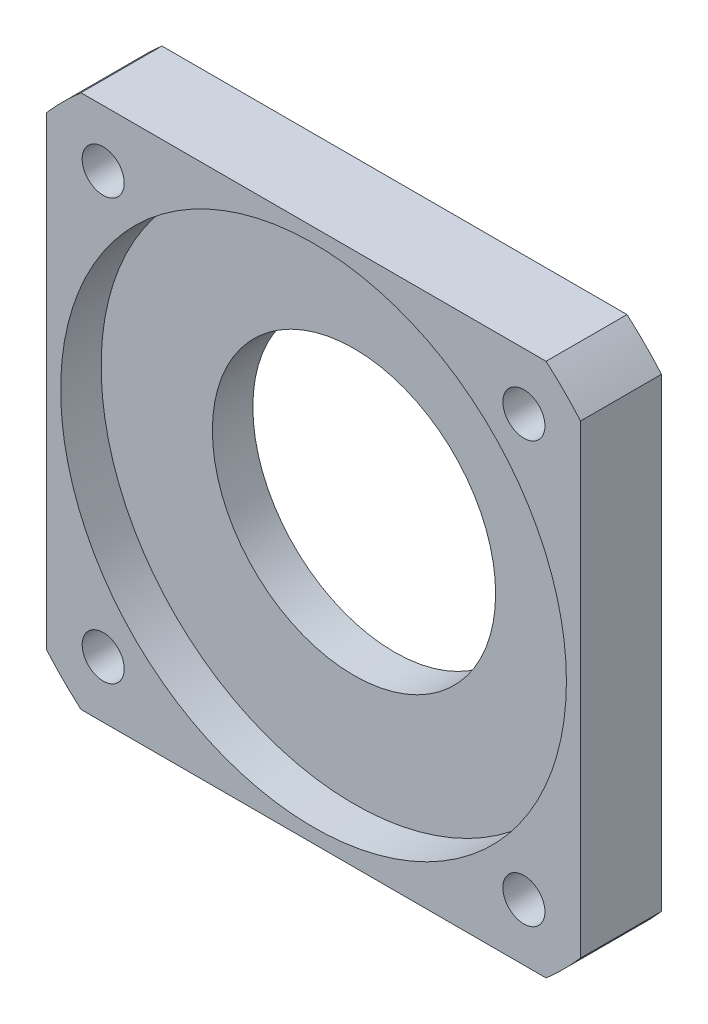
ISO-10303-21;
HEADER;
FILE_DESCRIPTION(('STEP AP214'),'2;1');
FILE_NAME('part.step','',(''),(''),'','','');
FILE_SCHEMA(('AUTOMOTIVE_DESIGN { 1 0 10303 214 1 1 1 1 }'));
ENDSEC;
DATA;
#1=APPLICATION_CONTEXT('core data for automotive mechanical design processes');
#2=APPLICATION_PROTOCOL_DEFINITION('international standard','automotive_design',2000,#1);
#3=PRODUCT_CONTEXT('',#1,'mechanical');
#4=PRODUCT('Part','Part','',(#3));
#5=PRODUCT_RELATED_PRODUCT_CATEGORY('part','',(#4));
#6=PRODUCT_DEFINITION_FORMATION('','',#4);
#7=PRODUCT_DEFINITION_CONTEXT('part definition',#1,'design');
#8=PRODUCT_DEFINITION('design','',#6,#7);
#9=PRODUCT_DEFINITION_SHAPE('','',#8);
#10=(LENGTH_UNIT() NAMED_UNIT(*) SI_UNIT(.MILLI.,.METRE.));
#11=(NAMED_UNIT(*) PLANE_ANGLE_UNIT() SI_UNIT($,.RADIAN.));
#12=(NAMED_UNIT(*) SI_UNIT($,.STERADIAN.) SOLID_ANGLE_UNIT());
#13=UNCERTAINTY_MEASURE_WITH_UNIT(LENGTH_MEASURE(1.E-05),#10,'distance_accuracy_value','');
#14=(GEOMETRIC_REPRESENTATION_CONTEXT(3) GLOBAL_UNCERTAINTY_ASSIGNED_CONTEXT((#13)) GLOBAL_UNIT_ASSIGNED_CONTEXT((#10,
#11,#12)) REPRESENTATION_CONTEXT('',''));
#15=CARTESIAN_POINT('',(0.,0.,0.));
#16=DIRECTION('',(0.,0.,1.));
#17=DIRECTION('',(1.,0.,0.));
#18=AXIS2_PLACEMENT_3D('',#15,#16,#17);
#19=CARTESIAN_POINT('',(20.955,20.955,6.35));
#20=DIRECTION('',(0.,0.,-1.));
#21=DIRECTION('',(-1.,0.,0.));
#22=AXIS2_PLACEMENT_3D('',#19,#20,#21);
#23=CYLINDRICAL_SURFACE('',#22,11.1125);
#24=CARTESIAN_POINT('',(20.955,20.955,0.));
#25=DIRECTION('',(0.,0.,1.));
#26=DIRECTION('',(1.,0.,0.));
#27=AXIS2_PLACEMENT_3D('',#24,#25,#26);
#28=CIRCLE('',#27,11.1125);
#29=CARTESIAN_POINT('',(32.0675,20.955,0.));
#30=VERTEX_POINT('',#29);
#31=EDGE_CURVE('E154',#30,#30,#28,.T.);
#32=ORIENTED_EDGE('',*,*,#31,.F.);
#33=EDGE_LOOP('',(#32));
#34=FACE_BOUND('',#33,.T.);
#35=CARTESIAN_POINT('',(20.955,20.955,3.175));
#36=DIRECTION('',(0.,0.,1.));
#37=DIRECTION('',(1.,0.,0.));
#38=AXIS2_PLACEMENT_3D('',#35,#36,#37);
#39=CIRCLE('',#38,11.1125);
#40=CARTESIAN_POINT('',(32.0675,20.955,3.175));
#41=VERTEX_POINT('',#40);
#42=EDGE_CURVE('E37',#41,#41,#39,.T.);
#43=ORIENTED_EDGE('',*,*,#42,.T.);
#44=EDGE_LOOP('',(#43));
#45=FACE_BOUND('',#44,.T.);
#46=ADVANCED_FACE('F33',(#34,#45),#23,.F.);
#47=CARTESIAN_POINT('',(0.,0.,6.35));
#48=DIRECTION('',(0.,0.,-1.));
#49=DIRECTION('',(-1.,0.,0.));
#50=AXIS2_PLACEMENT_3D('',#47,#48,#49);
#51=PLANE('',#50);
#52=CARTESIAN_POINT('',(20.955,20.955,6.35));
#53=DIRECTION('',(0.,0.,1.));
#54=DIRECTION('',(1.,0.,0.));
#55=AXIS2_PLACEMENT_3D('',#52,#53,#54);
#56=CIRCLE('',#55,19.84375);
#57=CARTESIAN_POINT('',(40.79875,20.955,6.35));
#58=VERTEX_POINT('',#57);
#59=EDGE_CURVE('E243',#58,#58,#56,.T.);
#60=ORIENTED_EDGE('',*,*,#59,.F.);
#61=EDGE_LOOP('',(#60));
#62=FACE_BOUND('',#61,.T.);
#63=CARTESIAN_POINT('',(4.44928924947582,4.44928924947489,6.35));
#64=DIRECTION('',(0.,0.,1.));
#65=DIRECTION('',(1.,0.,0.));
#66=AXIS2_PLACEMENT_3D('',#63,#64,#65);
#67=CIRCLE('',#66,1.64973);
#68=CARTESIAN_POINT('',(6.09901924947582,4.44928924947489,6.35));
#69=VERTEX_POINT('',#68);
#70=EDGE_CURVE('E188',#69,#69,#67,.T.);
#71=ORIENTED_EDGE('',*,*,#70,.F.);
#72=EDGE_LOOP('',(#71));
#73=FACE_BOUND('',#72,.T.);
#74=CARTESIAN_POINT('',(37.4607107505251,37.4607107505251,6.35));
#75=DIRECTION('',(0.,0.,1.));
#76=DIRECTION('',(1.,0.,0.));
#77=AXIS2_PLACEMENT_3D('',#74,#75,#76);
#78=CIRCLE('',#77,1.64973);
#79=CARTESIAN_POINT('',(39.1104407505251,37.4607107505251,6.35));
#80=VERTEX_POINT('',#79);
#81=EDGE_CURVE('E144',#80,#80,#78,.T.);
#82=ORIENTED_EDGE('',*,*,#81,.F.);
#83=EDGE_LOOP('',(#82));
#84=FACE_BOUND('',#83,.T.);
#85=CARTESIAN_POINT('',(37.4607107505255,4.44928924947537,6.35));
#86=DIRECTION('',(0.,0.,1.));
#87=DIRECTION('',(1.,0.,0.));
#88=AXIS2_PLACEMENT_3D('',#85,#86,#87);
#89=CIRCLE('',#88,1.64973);
#90=CARTESIAN_POINT('',(39.1104407505255,4.44928924947537,6.35));
#91=VERTEX_POINT('',#90);
#92=EDGE_CURVE('E194',#91,#91,#89,.T.);
#93=ORIENTED_EDGE('',*,*,#92,.F.);
#94=EDGE_LOOP('',(#93));
#95=FACE_BOUND('',#94,.T.);
#96=CARTESIAN_POINT('',(4.44928924947507,37.4607107505243,6.35));
#97=DIRECTION('',(0.,0.,1.));
#98=DIRECTION('',(1.,0.,0.));
#99=AXIS2_PLACEMENT_3D('',#96,#97,#98);
#100=CIRCLE('',#99,1.64973);
#101=CARTESIAN_POINT('',(6.09901924947507,37.4607107505243,6.35));
#102=VERTEX_POINT('',#101);
#103=EDGE_CURVE('E182',#102,#102,#100,.T.);
#104=ORIENTED_EDGE('',*,*,#103,.F.);
#105=EDGE_LOOP('',(#104));
#106=FACE_BOUND('',#105,.T.);
#107=CARTESIAN_POINT('',(20.955,20.955,6.35));
#108=DIRECTION('',(0.,0.,1.));
#109=DIRECTION('',(1.,0.,0.));
#110=AXIS2_PLACEMENT_3D('',#107,#108,#109);
#111=CIRCLE('',#110,27.7876);
#112=CARTESIAN_POINT('',(2.70565237439978,41.91,6.35));
#113=VERTEX_POINT('',#112);
#114=CARTESIAN_POINT('',(0.,39.2043476256002,6.35));
#115=VERTEX_POINT('',#114);
#116=EDGE_CURVE('E245',#113,#115,#111,.T.);
#117=ORIENTED_EDGE('',*,*,#116,.T.);
#118=DIRECTION('',(0.,-1.,0.));
#119=VECTOR('',#118,1.);
#120=CARTESIAN_POINT('',(0.,0.,6.35));
#121=LINE('',#120,#119);
#122=CARTESIAN_POINT('',(0.,2.70565237439979,6.35));
#123=VERTEX_POINT('',#122);
#124=EDGE_CURVE('E124',#115,#123,#121,.T.);
#125=ORIENTED_EDGE('',*,*,#124,.T.);
#126=CARTESIAN_POINT('',(2.70565237439979,0.,6.35));
#127=VERTEX_POINT('',#126);
#128=EDGE_CURVE('E166',#123,#127,#111,.T.);
#129=ORIENTED_EDGE('',*,*,#128,.T.);
#130=DIRECTION('',(1.,0.,0.));
#131=VECTOR('',#130,1.);
#132=CARTESIAN_POINT('',(0.,0.,6.35));
#133=LINE('',#132,#131);
#134=CARTESIAN_POINT('',(39.2043476256002,0.,6.35));
#135=VERTEX_POINT('',#134);
#136=EDGE_CURVE('E140',#127,#135,#133,.T.);
#137=ORIENTED_EDGE('',*,*,#136,.T.);
#138=CARTESIAN_POINT('',(41.91,2.70565237439978,6.35));
#139=VERTEX_POINT('',#138);
#140=EDGE_CURVE('E165',#135,#139,#111,.T.);
#141=ORIENTED_EDGE('',*,*,#140,.T.);
#142=DIRECTION('',(0.,1.,0.));
#143=VECTOR('',#142,1.);
#144=CARTESIAN_POINT('',(41.91,0.,6.35));
#145=LINE('',#144,#143);
#146=CARTESIAN_POINT('',(41.91,39.2043476256002,6.35));
#147=VERTEX_POINT('',#146);
#148=EDGE_CURVE('E135',#139,#147,#145,.T.);
#149=ORIENTED_EDGE('',*,*,#148,.T.);
#150=CARTESIAN_POINT('',(39.2043476256002,41.91,6.35));
#151=VERTEX_POINT('',#150);
#152=EDGE_CURVE('E103',#147,#151,#111,.T.);
#153=ORIENTED_EDGE('',*,*,#152,.T.);
#154=DIRECTION('',(-1.,0.,0.));
#155=VECTOR('',#154,1.);
#156=CARTESIAN_POINT('',(0.,41.91,6.35));
#157=LINE('',#156,#155);
#158=EDGE_CURVE('E131',#151,#113,#157,.T.);
#159=ORIENTED_EDGE('',*,*,#158,.T.);
#160=EDGE_LOOP('',(#117,#125,#129,#137,#141,#149,#153,#159));
#161=FACE_BOUND('',#160,.T.);
#162=ADVANCED_FACE('F164',(#62,#73,#84,#95,#106,#161),#51,.F.);
#163=CARTESIAN_POINT('',(0.,0.,0.));
#164=DIRECTION('',(0.,0.,-1.));
#165=DIRECTION('',(-1.,0.,0.));
#166=AXIS2_PLACEMENT_3D('',#163,#164,#165);
#167=PLANE('',#166);
#168=CARTESIAN_POINT('',(4.44928924947582,4.44928924947489,0.));
#169=DIRECTION('',(0.,0.,1.));
#170=DIRECTION('',(1.,0.,0.));
#171=AXIS2_PLACEMENT_3D('',#168,#169,#170);
#172=CIRCLE('',#171,1.64973);
#173=CARTESIAN_POINT('',(6.09901924947582,4.44928924947489,0.));
#174=VERTEX_POINT('',#173);
#175=EDGE_CURVE('E185',#174,#174,#172,.T.);
#176=ORIENTED_EDGE('',*,*,#175,.T.);
#177=EDGE_LOOP('',(#176));
#178=FACE_BOUND('',#177,.T.);
#179=ORIENTED_EDGE('',*,*,#31,.T.);
#180=EDGE_LOOP('',(#179));
#181=FACE_BOUND('',#180,.T.);
#182=CARTESIAN_POINT('',(37.4607107505251,37.4607107505251,0.));
#183=DIRECTION('',(0.,0.,1.));
#184=DIRECTION('',(1.,0.,0.));
#185=AXIS2_PLACEMENT_3D('',#182,#183,#184);
#186=CIRCLE('',#185,1.64973);
#187=CARTESIAN_POINT('',(39.1104407505251,37.4607107505251,0.));
#188=VERTEX_POINT('',#187);
#189=EDGE_CURVE('E149',#188,#188,#186,.T.);
#190=ORIENTED_EDGE('',*,*,#189,.T.);
#191=EDGE_LOOP('',(#190));
#192=FACE_BOUND('',#191,.T.);
#193=CARTESIAN_POINT('',(37.4607107505255,4.44928924947537,0.));
#194=DIRECTION('',(0.,0.,1.));
#195=DIRECTION('',(1.,0.,0.));
#196=AXIS2_PLACEMENT_3D('',#193,#194,#195);
#197=CIRCLE('',#196,1.64973);
#198=CARTESIAN_POINT('',(39.1104407505255,4.44928924947537,0.));
#199=VERTEX_POINT('',#198);
#200=EDGE_CURVE('E191',#199,#199,#197,.T.);
#201=ORIENTED_EDGE('',*,*,#200,.T.);
#202=EDGE_LOOP('',(#201));
#203=FACE_BOUND('',#202,.T.);
#204=CARTESIAN_POINT('',(4.44928924947507,37.4607107505243,0.));
#205=DIRECTION('',(0.,0.,1.));
#206=DIRECTION('',(1.,0.,0.));
#207=AXIS2_PLACEMENT_3D('',#204,#205,#206);
#208=CIRCLE('',#207,1.64973);
#209=CARTESIAN_POINT('',(6.09901924947507,37.4607107505243,0.));
#210=VERTEX_POINT('',#209);
#211=EDGE_CURVE('E181',#210,#210,#208,.T.);
#212=ORIENTED_EDGE('',*,*,#211,.T.);
#213=EDGE_LOOP('',(#212));
#214=FACE_BOUND('',#213,.T.);
#215=DIRECTION('',(0.,-1.,0.));
#216=VECTOR('',#215,1.);
#217=CARTESIAN_POINT('',(0.,0.,0.));
#218=LINE('',#217,#216);
#219=CARTESIAN_POINT('',(0.,39.2043476256002,0.));
#220=VERTEX_POINT('',#219);
#221=CARTESIAN_POINT('',(0.,2.70565237439979,0.));
#222=VERTEX_POINT('',#221);
#223=EDGE_CURVE('E127',#220,#222,#218,.T.);
#224=ORIENTED_EDGE('',*,*,#223,.F.);
#225=CARTESIAN_POINT('',(20.955,20.955,0.));
#226=DIRECTION('',(0.,0.,1.));
#227=DIRECTION('',(1.,0.,0.));
#228=AXIS2_PLACEMENT_3D('',#225,#226,#227);
#229=CIRCLE('',#228,27.7876);
#230=CARTESIAN_POINT('',(2.70565237439978,41.91,0.));
#231=VERTEX_POINT('',#230);
#232=EDGE_CURVE('E119',#231,#220,#229,.T.);
#233=ORIENTED_EDGE('',*,*,#232,.F.);
#234=DIRECTION('',(-1.,0.,0.));
#235=VECTOR('',#234,1.);
#236=CARTESIAN_POINT('',(0.,41.91,0.));
#237=LINE('',#236,#235);
#238=CARTESIAN_POINT('',(39.2043476256002,41.91,0.));
#239=VERTEX_POINT('',#238);
#240=EDGE_CURVE('E118',#239,#231,#237,.T.);
#241=ORIENTED_EDGE('',*,*,#240,.F.);
#242=CARTESIAN_POINT('',(41.91,39.2043476256002,0.));
#243=VERTEX_POINT('',#242);
#244=EDGE_CURVE('E100',#243,#239,#229,.T.);
#245=ORIENTED_EDGE('',*,*,#244,.F.);
#246=DIRECTION('',(0.,1.,0.));
#247=VECTOR('',#246,1.);
#248=CARTESIAN_POINT('',(41.91,0.,0.));
#249=LINE('',#248,#247);
#250=CARTESIAN_POINT('',(41.91,2.70565237439978,0.));
#251=VERTEX_POINT('',#250);
#252=EDGE_CURVE('E115',#251,#243,#249,.T.);
#253=ORIENTED_EDGE('',*,*,#252,.F.);
#254=CARTESIAN_POINT('',(39.2043476256002,0.,0.));
#255=VERTEX_POINT('',#254);
#256=EDGE_CURVE('E57',#255,#251,#229,.T.);
#257=ORIENTED_EDGE('',*,*,#256,.F.);
#258=DIRECTION('',(1.,0.,0.));
#259=VECTOR('',#258,1.);
#260=CARTESIAN_POINT('',(0.,0.,0.));
#261=LINE('',#260,#259);
#262=CARTESIAN_POINT('',(2.70565237439979,0.,0.));
#263=VERTEX_POINT('',#262);
#264=EDGE_CURVE('E122',#263,#255,#261,.T.);
#265=ORIENTED_EDGE('',*,*,#264,.F.);
#266=EDGE_CURVE('E49',#222,#263,#229,.T.);
#267=ORIENTED_EDGE('',*,*,#266,.F.);
#268=EDGE_LOOP('',(#224,#233,#241,#245,#253,#257,#265,#267));
#269=FACE_BOUND('',#268,.T.);
#270=ADVANCED_FACE('F114',(#178,#181,#192,#203,#214,#269),#167,.T.);
#271=CARTESIAN_POINT('',(0.,0.,6.35));
#272=DIRECTION('',(1.,0.,0.));
#273=DIRECTION('',(0.,0.,-1.));
#274=AXIS2_PLACEMENT_3D('',#271,#272,#273);
#275=PLANE('',#274);
#276=DIRECTION('',(0.,0.,1.));
#277=VECTOR('',#276,1.);
#278=CARTESIAN_POINT('',(0.,39.2043476256002,0.));
#279=LINE('',#278,#277);
#280=EDGE_CURVE('E179',#220,#115,#279,.T.);
#281=ORIENTED_EDGE('',*,*,#280,.F.);
#282=ORIENTED_EDGE('',*,*,#223,.T.);
#283=DIRECTION('',(0.,0.,1.));
#284=VECTOR('',#283,1.);
#285=CARTESIAN_POINT('',(0.,2.70565237439979,0.));
#286=LINE('',#285,#284);
#287=EDGE_CURVE('E174',#123,#222,#286,.F.);
#288=ORIENTED_EDGE('',*,*,#287,.F.);
#289=ORIENTED_EDGE('',*,*,#124,.F.);
#290=EDGE_LOOP('',(#281,#282,#288,#289));
#291=FACE_BOUND('',#290,.T.);
#292=ADVANCED_FACE('F35',(#291),#275,.F.);
#293=CARTESIAN_POINT('',(0.,0.,6.35));
#294=DIRECTION('',(0.,1.,0.));
#295=DIRECTION('',(0.,0.,1.));
#296=AXIS2_PLACEMENT_3D('',#293,#294,#295);
#297=PLANE('',#296);
#298=DIRECTION('',(0.,0.,1.));
#299=VECTOR('',#298,1.);
#300=CARTESIAN_POINT('',(2.70565237439979,0.,0.));
#301=LINE('',#300,#299);
#302=EDGE_CURVE('E170',#263,#127,#301,.T.);
#303=ORIENTED_EDGE('',*,*,#302,.F.);
#304=ORIENTED_EDGE('',*,*,#264,.T.);
#305=DIRECTION('',(0.,0.,1.));
#306=VECTOR('',#305,1.);
#307=CARTESIAN_POINT('',(39.2043476256002,0.,0.));
#308=LINE('',#307,#306);
#309=EDGE_CURVE('E172',#135,#255,#308,.F.);
#310=ORIENTED_EDGE('',*,*,#309,.F.);
#311=ORIENTED_EDGE('',*,*,#136,.F.);
#312=EDGE_LOOP('',(#303,#304,#310,#311));
#313=FACE_BOUND('',#312,.T.);
#314=ADVANCED_FACE('F169',(#313),#297,.F.);
#315=CARTESIAN_POINT('',(41.91,0.,6.35));
#316=DIRECTION('',(-1.,0.,0.));
#317=DIRECTION('',(0.,0.,1.));
#318=AXIS2_PLACEMENT_3D('',#315,#316,#317);
#319=PLANE('',#318);
#320=DIRECTION('',(0.,0.,1.));
#321=VECTOR('',#320,1.);
#322=CARTESIAN_POINT('',(41.91,2.70565237439978,0.));
#323=LINE('',#322,#321);
#324=EDGE_CURVE('E108',#251,#139,#323,.T.);
#325=ORIENTED_EDGE('',*,*,#324,.F.);
#326=ORIENTED_EDGE('',*,*,#252,.T.);
#327=DIRECTION('',(0.,0.,1.));
#328=VECTOR('',#327,1.);
#329=CARTESIAN_POINT('',(41.91,39.2043476256002,0.));
#330=LINE('',#329,#328);
#331=EDGE_CURVE('E97',#147,#243,#330,.F.);
#332=ORIENTED_EDGE('',*,*,#331,.F.);
#333=ORIENTED_EDGE('',*,*,#148,.F.);
#334=EDGE_LOOP('',(#325,#326,#332,#333));
#335=FACE_BOUND('',#334,.T.);
#336=ADVANCED_FACE('F121',(#335),#319,.F.);
#337=CARTESIAN_POINT('',(0.,41.91,6.35));
#338=DIRECTION('',(0.,-1.,0.));
#339=DIRECTION('',(0.,0.,-1.));
#340=AXIS2_PLACEMENT_3D('',#337,#338,#339);
#341=PLANE('',#340);
#342=DIRECTION('',(0.,0.,1.));
#343=VECTOR('',#342,1.);
#344=CARTESIAN_POINT('',(39.2043476256002,41.91,0.));
#345=LINE('',#344,#343);
#346=EDGE_CURVE('E11',#239,#151,#345,.T.);
#347=ORIENTED_EDGE('',*,*,#346,.F.);
#348=ORIENTED_EDGE('',*,*,#240,.T.);
#349=DIRECTION('',(0.,0.,1.));
#350=VECTOR('',#349,1.);
#351=CARTESIAN_POINT('',(2.70565237439978,41.91,0.));
#352=LINE('',#351,#350);
#353=EDGE_CURVE('E42',#113,#231,#352,.F.);
#354=ORIENTED_EDGE('',*,*,#353,.F.);
#355=ORIENTED_EDGE('',*,*,#158,.F.);
#356=EDGE_LOOP('',(#347,#348,#354,#355));
#357=FACE_BOUND('',#356,.T.);
#358=ADVANCED_FACE('F214',(#357),#341,.F.);
#359=CARTESIAN_POINT('',(37.4607107505251,37.4607107505251,6.35));
#360=DIRECTION('',(0.,0.,-1.));
#361=DIRECTION('',(-1.,0.,0.));
#362=AXIS2_PLACEMENT_3D('',#359,#360,#361);
#363=CYLINDRICAL_SURFACE('',#362,1.64973);
#364=ORIENTED_EDGE('',*,*,#81,.T.);
#365=EDGE_LOOP('',(#364));
#366=FACE_BOUND('',#365,.T.);
#367=ORIENTED_EDGE('',*,*,#189,.F.);
#368=EDGE_LOOP('',(#367));
#369=FACE_BOUND('',#368,.T.);
#370=ADVANCED_FACE('F204',(#366,#369),#363,.F.);
#371=CARTESIAN_POINT('',(37.4607107505255,4.44928924947537,6.35));
#372=DIRECTION('',(0.,0.,-1.));
#373=DIRECTION('',(-1.,0.,0.));
#374=AXIS2_PLACEMENT_3D('',#371,#372,#373);
#375=CYLINDRICAL_SURFACE('',#374,1.64973);
#376=ORIENTED_EDGE('',*,*,#92,.T.);
#377=EDGE_LOOP('',(#376));
#378=FACE_BOUND('',#377,.T.);
#379=ORIENTED_EDGE('',*,*,#200,.F.);
#380=EDGE_LOOP('',(#379));
#381=FACE_BOUND('',#380,.T.);
#382=ADVANCED_FACE('F201',(#378,#381),#375,.F.);
#383=CARTESIAN_POINT('',(4.44928924947582,4.44928924947489,6.35));
#384=DIRECTION('',(0.,0.,-1.));
#385=DIRECTION('',(-1.,0.,0.));
#386=AXIS2_PLACEMENT_3D('',#383,#384,#385);
#387=CYLINDRICAL_SURFACE('',#386,1.64973);
#388=ORIENTED_EDGE('',*,*,#70,.T.);
#389=EDGE_LOOP('',(#388));
#390=FACE_BOUND('',#389,.T.);
#391=ORIENTED_EDGE('',*,*,#175,.F.);
#392=EDGE_LOOP('',(#391));
#393=FACE_BOUND('',#392,.T.);
#394=ADVANCED_FACE('F203',(#390,#393),#387,.F.);
#395=CARTESIAN_POINT('',(4.44928924947507,37.4607107505243,6.35));
#396=DIRECTION('',(0.,0.,-1.));
#397=DIRECTION('',(-1.,0.,0.));
#398=AXIS2_PLACEMENT_3D('',#395,#396,#397);
#399=CYLINDRICAL_SURFACE('',#398,1.64973);
#400=ORIENTED_EDGE('',*,*,#103,.T.);
#401=EDGE_LOOP('',(#400));
#402=FACE_BOUND('',#401,.T.);
#403=ORIENTED_EDGE('',*,*,#211,.F.);
#404=EDGE_LOOP('',(#403));
#405=FACE_BOUND('',#404,.T.);
#406=ADVANCED_FACE('F211',(#402,#405),#399,.F.);
#407=CARTESIAN_POINT('',(20.955,20.955,0.));
#408=DIRECTION('',(0.,0.,1.));
#409=DIRECTION('',(1.,0.,0.));
#410=AXIS2_PLACEMENT_3D('',#407,#408,#409);
#411=CYLINDRICAL_SURFACE('',#410,27.7876);
#412=ORIENTED_EDGE('',*,*,#280,.T.);
#413=ORIENTED_EDGE('',*,*,#116,.F.);
#414=ORIENTED_EDGE('',*,*,#353,.T.);
#415=ORIENTED_EDGE('',*,*,#232,.T.);
#416=EDGE_LOOP('',(#412,#413,#414,#415));
#417=FACE_BOUND('',#416,.T.);
#418=ADVANCED_FACE('F266',(#417),#411,.T.);
#419=ORIENTED_EDGE('',*,*,#331,.T.);
#420=ORIENTED_EDGE('',*,*,#244,.T.);
#421=ORIENTED_EDGE('',*,*,#346,.T.);
#422=ORIENTED_EDGE('',*,*,#152,.F.);
#423=EDGE_LOOP('',(#419,#420,#421,#422));
#424=FACE_BOUND('',#423,.T.);
#425=ADVANCED_FACE('F99',(#424),#411,.T.);
#426=ORIENTED_EDGE('',*,*,#309,.T.);
#427=ORIENTED_EDGE('',*,*,#256,.T.);
#428=ORIENTED_EDGE('',*,*,#324,.T.);
#429=ORIENTED_EDGE('',*,*,#140,.F.);
#430=EDGE_LOOP('',(#426,#427,#428,#429));
#431=FACE_BOUND('',#430,.T.);
#432=ADVANCED_FACE('F294',(#431),#411,.T.);
#433=ORIENTED_EDGE('',*,*,#287,.T.);
#434=ORIENTED_EDGE('',*,*,#266,.T.);
#435=ORIENTED_EDGE('',*,*,#302,.T.);
#436=ORIENTED_EDGE('',*,*,#128,.F.);
#437=EDGE_LOOP('',(#433,#434,#435,#436));
#438=FACE_BOUND('',#437,.T.);
#439=ADVANCED_FACE('F273',(#438),#411,.T.);
#440=CARTESIAN_POINT('',(20.955,20.955,3.175));
#441=DIRECTION('',(0.,0.,1.));
#442=DIRECTION('',(1.,0.,0.));
#443=AXIS2_PLACEMENT_3D('',#440,#441,#442);
#444=CYLINDRICAL_SURFACE('',#443,19.84375);
#445=CARTESIAN_POINT('',(20.955,20.955,3.175));
#446=DIRECTION('',(0.,0.,1.));
#447=DIRECTION('',(1.,0.,0.));
#448=AXIS2_PLACEMENT_3D('',#445,#446,#447);
#449=CIRCLE('',#448,19.84375);
#450=CARTESIAN_POINT('',(40.79875,20.955,3.175));
#451=VERTEX_POINT('',#450);
#452=EDGE_CURVE('E247',#451,#451,#449,.T.);
#453=ORIENTED_EDGE('',*,*,#452,.F.);
#454=EDGE_LOOP('',(#453));
#455=FACE_BOUND('',#454,.T.);
#456=ORIENTED_EDGE('',*,*,#59,.T.);
#457=EDGE_LOOP('',(#456));
#458=FACE_BOUND('',#457,.T.);
#459=ADVANCED_FACE('F255',(#455,#458),#444,.F.);
#460=CARTESIAN_POINT('',(20.955,20.955,3.175));
#461=DIRECTION('',(0.,0.,1.));
#462=DIRECTION('',(1.,0.,0.));
#463=AXIS2_PLACEMENT_3D('',#460,#461,#462);
#464=PLANE('',#463);
#465=ORIENTED_EDGE('',*,*,#42,.F.);
#466=EDGE_LOOP('',(#465));
#467=FACE_BOUND('',#466,.T.);
#468=ORIENTED_EDGE('',*,*,#452,.T.);
#469=EDGE_LOOP('',(#468));
#470=FACE_BOUND('',#469,.T.);
#471=ADVANCED_FACE('F277',(#467,#470),#464,.T.);
#472=CLOSED_SHELL('',(#46,#162,#270,#292,#314,#336,#358,#370,#382,#394,#406,#418,#425,#432,#439,
#459,#471));
#473=MANIFOLD_SOLID_BREP('B2',#472);
#474=ADVANCED_BREP_SHAPE_REPRESENTATION('',(#18,#473),#14);
#475=SHAPE_DEFINITION_REPRESENTATION(#9,#474);
ENDSEC;
END-ISO-10303-21;
